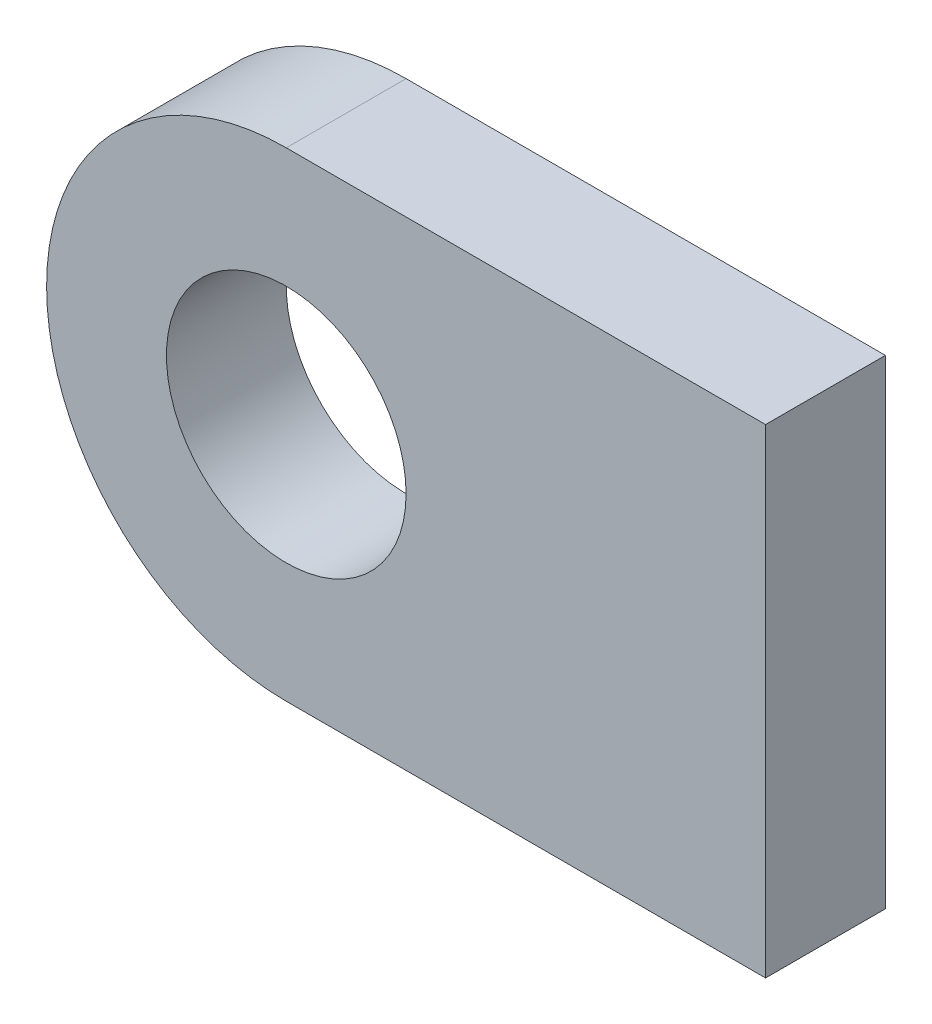
ISO-10303-21;
HEADER;
FILE_DESCRIPTION(('STEP AP214'),'2;1');
FILE_NAME('part.step','',(''),(''),'','','');
FILE_SCHEMA(('AUTOMOTIVE_DESIGN { 1 0 10303 214 1 1 1 1 }'));
ENDSEC;
DATA;
#1=APPLICATION_CONTEXT('core data for automotive mechanical design processes');
#2=APPLICATION_PROTOCOL_DEFINITION('international standard','automotive_design',2000,#1);
#3=PRODUCT_CONTEXT('',#1,'mechanical');
#4=PRODUCT('Part','Part','',(#3));
#5=PRODUCT_RELATED_PRODUCT_CATEGORY('part','',(#4));
#6=PRODUCT_DEFINITION_FORMATION('','',#4);
#7=PRODUCT_DEFINITION_CONTEXT('part definition',#1,'design');
#8=PRODUCT_DEFINITION('design','',#6,#7);
#9=PRODUCT_DEFINITION_SHAPE('','',#8);
#10=(LENGTH_UNIT() NAMED_UNIT(*) SI_UNIT(.MILLI.,.METRE.));
#11=(NAMED_UNIT(*) PLANE_ANGLE_UNIT() SI_UNIT($,.RADIAN.));
#12=(NAMED_UNIT(*) SI_UNIT($,.STERADIAN.) SOLID_ANGLE_UNIT());
#13=UNCERTAINTY_MEASURE_WITH_UNIT(LENGTH_MEASURE(1.E-05),#10,'distance_accuracy_value','');
#14=(GEOMETRIC_REPRESENTATION_CONTEXT(3) GLOBAL_UNCERTAINTY_ASSIGNED_CONTEXT((#13)) GLOBAL_UNIT_ASSIGNED_CONTEXT((#10,
#11,#12)) REPRESENTATION_CONTEXT('',''));
#15=CARTESIAN_POINT('',(0.,0.,0.));
#16=DIRECTION('',(0.,0.,1.));
#17=DIRECTION('',(1.,0.,0.));
#18=AXIS2_PLACEMENT_3D('',#15,#16,#17);
#19=CARTESIAN_POINT('',(-33.5488902970877,0.,5.));
#20=DIRECTION('',(0.,0.,-1.));
#21=DIRECTION('',(-1.,0.,0.));
#22=AXIS2_PLACEMENT_3D('',#19,#20,#21);
#23=CYLINDRICAL_SURFACE('',#22,10.);
#24=CARTESIAN_POINT('',(-33.5488902970877,0.,0.));
#25=DIRECTION('',(0.,0.,1.));
#26=DIRECTION('',(1.,0.,0.));
#27=AXIS2_PLACEMENT_3D('',#24,#25,#26);
#28=CIRCLE('',#27,10.);
#29=CARTESIAN_POINT('',(-33.5488902970877,10.,0.));
#30=VERTEX_POINT('',#29);
#31=CARTESIAN_POINT('',(-33.5488902970877,-10.,0.));
#32=VERTEX_POINT('',#31);
#33=EDGE_CURVE('E101',#30,#32,#28,.T.);
#34=ORIENTED_EDGE('',*,*,#33,.T.);
#35=DIRECTION('',(0.,0.,-1.));
#36=VECTOR('',#35,1.);
#37=CARTESIAN_POINT('',(-33.5488902970877,-10.,5.));
#38=LINE('',#37,#36);
#39=CARTESIAN_POINT('',(-33.5488902970877,-10.,5.));
#40=VERTEX_POINT('',#39);
#41=EDGE_CURVE('E11',#40,#32,#38,.T.);
#42=ORIENTED_EDGE('',*,*,#41,.F.);
#43=CARTESIAN_POINT('',(-33.5488902970877,0.,5.));
#44=DIRECTION('',(0.,0.,1.));
#45=DIRECTION('',(1.,0.,0.));
#46=AXIS2_PLACEMENT_3D('',#43,#44,#45);
#47=CIRCLE('',#46,10.);
#48=CARTESIAN_POINT('',(-33.5488902970877,10.,5.));
#49=VERTEX_POINT('',#48);
#50=EDGE_CURVE('E87',#49,#40,#47,.T.);
#51=ORIENTED_EDGE('',*,*,#50,.F.);
#52=DIRECTION('',(0.,0.,-1.));
#53=VECTOR('',#52,1.);
#54=CARTESIAN_POINT('',(-33.5488902970877,10.,5.));
#55=LINE('',#54,#53);
#56=EDGE_CURVE('E54',#49,#30,#55,.T.);
#57=ORIENTED_EDGE('',*,*,#56,.T.);
#58=EDGE_LOOP('',(#34,#42,#51,#57));
#59=FACE_BOUND('',#58,.T.);
#60=ADVANCED_FACE('F38',(#59),#23,.T.);
#61=CARTESIAN_POINT('',(-33.5488902970877,-10.,5.));
#62=DIRECTION('',(0.,1.,0.));
#63=DIRECTION('',(0.,0.,1.));
#64=AXIS2_PLACEMENT_3D('',#61,#62,#63);
#65=PLANE('',#64);
#66=DIRECTION('',(1.,0.,0.));
#67=VECTOR('',#66,1.);
#68=CARTESIAN_POINT('',(-33.5488902970877,-10.,0.));
#69=LINE('',#68,#67);
#70=CARTESIAN_POINT('',(-13.5488902970877,-10.,0.));
#71=VERTEX_POINT('',#70);
#72=EDGE_CURVE('E92',#32,#71,#69,.T.);
#73=ORIENTED_EDGE('',*,*,#72,.T.);
#74=DIRECTION('',(0.,0.,-1.));
#75=VECTOR('',#74,1.);
#76=CARTESIAN_POINT('',(-13.5488902970877,-10.,5.));
#77=LINE('',#76,#75);
#78=CARTESIAN_POINT('',(-13.5488902970877,-10.,5.));
#79=VERTEX_POINT('',#78);
#80=EDGE_CURVE('E46',#79,#71,#77,.T.);
#81=ORIENTED_EDGE('',*,*,#80,.F.);
#82=DIRECTION('',(1.,0.,0.));
#83=VECTOR('',#82,1.);
#84=CARTESIAN_POINT('',(-33.5488902970877,-10.,5.));
#85=LINE('',#84,#83);
#86=EDGE_CURVE('E79',#40,#79,#85,.T.);
#87=ORIENTED_EDGE('',*,*,#86,.F.);
#88=ORIENTED_EDGE('',*,*,#41,.T.);
#89=EDGE_LOOP('',(#73,#81,#87,#88));
#90=FACE_BOUND('',#89,.T.);
#91=ADVANCED_FACE('F91',(#90),#65,.F.);
#92=CARTESIAN_POINT('',(-13.5488902970877,10.,5.));
#93=DIRECTION('',(1.,0.,0.));
#94=DIRECTION('',(0.,1.,0.));
#95=AXIS2_PLACEMENT_3D('',#92,#93,#94);
#96=PLANE('',#95);
#97=DIRECTION('',(0.,-1.,0.));
#98=VECTOR('',#97,1.);
#99=CARTESIAN_POINT('',(-13.5488902970877,10.,0.));
#100=LINE('',#99,#98);
#101=CARTESIAN_POINT('',(-13.5488902970877,10.,0.));
#102=VERTEX_POINT('',#101);
#103=EDGE_CURVE('E105',#102,#71,#100,.T.);
#104=ORIENTED_EDGE('',*,*,#103,.F.);
#105=DIRECTION('',(0.,0.,-1.));
#106=VECTOR('',#105,1.);
#107=CARTESIAN_POINT('',(-13.5488902970877,10.,5.));
#108=LINE('',#107,#106);
#109=CARTESIAN_POINT('',(-13.5488902970877,10.,5.));
#110=VERTEX_POINT('',#109);
#111=EDGE_CURVE('E68',#110,#102,#108,.T.);
#112=ORIENTED_EDGE('',*,*,#111,.F.);
#113=DIRECTION('',(0.,-1.,0.));
#114=VECTOR('',#113,1.);
#115=CARTESIAN_POINT('',(-13.5488902970877,10.,5.));
#116=LINE('',#115,#114);
#117=EDGE_CURVE('E86',#110,#79,#116,.T.);
#118=ORIENTED_EDGE('',*,*,#117,.T.);
#119=ORIENTED_EDGE('',*,*,#80,.T.);
#120=EDGE_LOOP('',(#104,#112,#118,#119));
#121=FACE_BOUND('',#120,.T.);
#122=ADVANCED_FACE('F95',(#121),#96,.T.);
#123=CARTESIAN_POINT('',(-33.5488902970877,10.,5.));
#124=DIRECTION('',(0.,1.,0.));
#125=DIRECTION('',(0.,0.,1.));
#126=AXIS2_PLACEMENT_3D('',#123,#124,#125);
#127=PLANE('',#126);
#128=DIRECTION('',(1.,0.,0.));
#129=VECTOR('',#128,1.);
#130=CARTESIAN_POINT('',(-33.5488902970877,10.,0.));
#131=LINE('',#130,#129);
#132=EDGE_CURVE('E107',#30,#102,#131,.T.);
#133=ORIENTED_EDGE('',*,*,#132,.F.);
#134=ORIENTED_EDGE('',*,*,#56,.F.);
#135=DIRECTION('',(1.,0.,0.));
#136=VECTOR('',#135,1.);
#137=CARTESIAN_POINT('',(-33.5488902970877,10.,5.));
#138=LINE('',#137,#136);
#139=EDGE_CURVE('E96',#49,#110,#138,.T.);
#140=ORIENTED_EDGE('',*,*,#139,.T.);
#141=ORIENTED_EDGE('',*,*,#111,.T.);
#142=EDGE_LOOP('',(#133,#134,#140,#141));
#143=FACE_BOUND('',#142,.T.);
#144=ADVANCED_FACE('F124',(#143),#127,.T.);
#145=CARTESIAN_POINT('',(-33.5488902970877,0.,5.));
#146=DIRECTION('',(0.,0.,1.));
#147=DIRECTION('',(1.,0.,0.));
#148=AXIS2_PLACEMENT_3D('',#145,#146,#147);
#149=PLANE('',#148);
#150=CARTESIAN_POINT('',(-33.5488902970877,0.,5.));
#151=DIRECTION('',(0.,0.,1.));
#152=DIRECTION('',(1.,0.,0.));
#153=AXIS2_PLACEMENT_3D('',#150,#151,#152);
#154=CIRCLE('',#153,5.);
#155=CARTESIAN_POINT('',(-28.5488902970877,0.,5.));
#156=VERTEX_POINT('',#155);
#157=EDGE_CURVE('E115',#156,#156,#154,.T.);
#158=ORIENTED_EDGE('',*,*,#157,.F.);
#159=EDGE_LOOP('',(#158));
#160=FACE_BOUND('',#159,.T.);
#161=ORIENTED_EDGE('',*,*,#50,.T.);
#162=ORIENTED_EDGE('',*,*,#86,.T.);
#163=ORIENTED_EDGE('',*,*,#117,.F.);
#164=ORIENTED_EDGE('',*,*,#139,.F.);
#165=EDGE_LOOP('',(#161,#162,#163,#164));
#166=FACE_BOUND('',#165,.T.);
#167=ADVANCED_FACE('F83',(#160,#166),#149,.T.);
#168=CARTESIAN_POINT('',(-33.5488902970877,0.,0.));
#169=DIRECTION('',(0.,0.,1.));
#170=DIRECTION('',(1.,0.,0.));
#171=AXIS2_PLACEMENT_3D('',#168,#169,#170);
#172=PLANE('',#171);
#173=CARTESIAN_POINT('',(-33.5488902970877,0.,0.));
#174=DIRECTION('',(0.,0.,1.));
#175=DIRECTION('',(1.,0.,0.));
#176=AXIS2_PLACEMENT_3D('',#173,#174,#175);
#177=CIRCLE('',#176,5.);
#178=CARTESIAN_POINT('',(-28.5488902970877,0.,0.));
#179=VERTEX_POINT('',#178);
#180=EDGE_CURVE('E103',#179,#179,#177,.T.);
#181=ORIENTED_EDGE('',*,*,#180,.T.);
#182=EDGE_LOOP('',(#181));
#183=FACE_BOUND('',#182,.T.);
#184=ORIENTED_EDGE('',*,*,#33,.F.);
#185=ORIENTED_EDGE('',*,*,#132,.T.);
#186=ORIENTED_EDGE('',*,*,#103,.T.);
#187=ORIENTED_EDGE('',*,*,#72,.F.);
#188=EDGE_LOOP('',(#184,#185,#186,#187));
#189=FACE_BOUND('',#188,.T.);
#190=ADVANCED_FACE('F123',(#183,#189),#172,.F.);
#191=CARTESIAN_POINT('',(-33.5488902970877,0.,5.));
#192=DIRECTION('',(0.,0.,1.));
#193=DIRECTION('',(1.,0.,0.));
#194=AXIS2_PLACEMENT_3D('',#191,#192,#193);
#195=CYLINDRICAL_SURFACE('',#194,5.);
#196=ORIENTED_EDGE('',*,*,#157,.T.);
#197=EDGE_LOOP('',(#196));
#198=FACE_BOUND('',#197,.T.);
#199=ORIENTED_EDGE('',*,*,#180,.F.);
#200=EDGE_LOOP('',(#199));
#201=FACE_BOUND('',#200,.T.);
#202=ADVANCED_FACE('F119',(#198,#201),#195,.F.);
#203=CLOSED_SHELL('',(#60,#91,#122,#144,#167,#190,#202));
#204=MANIFOLD_SOLID_BREP('B2',#203);
#205=ADVANCED_BREP_SHAPE_REPRESENTATION('',(#18,#204),#14);
#206=SHAPE_DEFINITION_REPRESENTATION(#9,#205);
ENDSEC;
END-ISO-10303-21;
